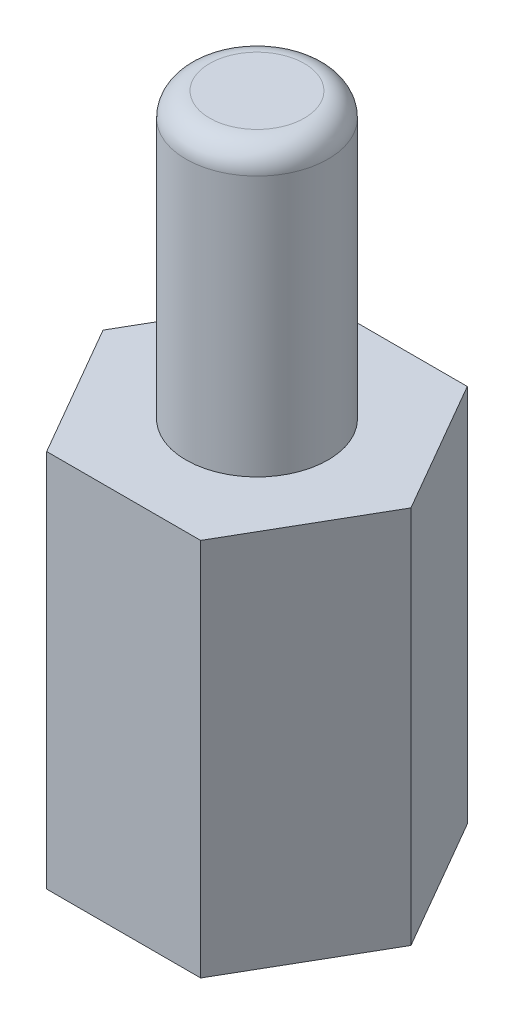
ISO-10303-21;
HEADER;
FILE_DESCRIPTION(('STEP AP214'),'2;1');
FILE_NAME('part.step','',(''),(''),'','','');
FILE_SCHEMA(('AUTOMOTIVE_DESIGN { 1 0 10303 214 1 1 1 1 }'));
ENDSEC;
DATA;
#1=APPLICATION_CONTEXT('core data for automotive mechanical design processes');
#2=APPLICATION_PROTOCOL_DEFINITION('international standard','automotive_design',2000,#1);
#3=PRODUCT_CONTEXT('',#1,'mechanical');
#4=PRODUCT('Part','Part','',(#3));
#5=PRODUCT_RELATED_PRODUCT_CATEGORY('part','',(#4));
#6=PRODUCT_DEFINITION_FORMATION('','',#4);
#7=PRODUCT_DEFINITION_CONTEXT('part definition',#1,'design');
#8=PRODUCT_DEFINITION('design','',#6,#7);
#9=PRODUCT_DEFINITION_SHAPE('','',#8);
#10=(LENGTH_UNIT() NAMED_UNIT(*) SI_UNIT(.MILLI.,.METRE.));
#11=(NAMED_UNIT(*) PLANE_ANGLE_UNIT() SI_UNIT($,.RADIAN.));
#12=(NAMED_UNIT(*) SI_UNIT($,.STERADIAN.) SOLID_ANGLE_UNIT());
#13=UNCERTAINTY_MEASURE_WITH_UNIT(LENGTH_MEASURE(1.E-05),#10,'distance_accuracy_value','');
#14=(GEOMETRIC_REPRESENTATION_CONTEXT(3) GLOBAL_UNCERTAINTY_ASSIGNED_CONTEXT((#13)) GLOBAL_UNIT_ASSIGNED_CONTEXT((#10,
#11,#12)) REPRESENTATION_CONTEXT('',''));
#15=CARTESIAN_POINT('',(0.,0.,0.));
#16=DIRECTION('',(0.,0.,1.));
#17=DIRECTION('',(1.,0.,0.));
#18=AXIS2_PLACEMENT_3D('',#15,#16,#17);
#19=CARTESIAN_POINT('',(0.,14.,0.));
#20=DIRECTION('',(0.,-1.,0.));
#21=DIRECTION('',(0.,0.,-1.));
#22=AXIS2_PLACEMENT_3D('',#19,#20,#21);
#23=CYLINDRICAL_SURFACE('',#22,1.5);
#24=CARTESIAN_POINT('',(0.,8.,0.));
#25=DIRECTION('',(0.,1.,0.));
#26=DIRECTION('',(0.,0.,1.));
#27=AXIS2_PLACEMENT_3D('',#24,#25,#26);
#28=CIRCLE('',#27,1.5);
#29=CARTESIAN_POINT('',(0.,8.,1.5));
#30=VERTEX_POINT('',#29);
#31=EDGE_CURVE('E138',#30,#30,#28,.T.);
#32=ORIENTED_EDGE('',*,*,#31,.T.);
#33=EDGE_LOOP('',(#32));
#34=FACE_BOUND('',#33,.T.);
#35=CARTESIAN_POINT('',(0.,13.5,0.));
#36=DIRECTION('',(0.,1.,0.));
#37=DIRECTION('',(0.,0.,1.));
#38=AXIS2_PLACEMENT_3D('',#35,#36,#37);
#39=CIRCLE('',#38,1.5);
#40=CARTESIAN_POINT('',(0.,13.5,1.5));
#41=VERTEX_POINT('',#40);
#42=EDGE_CURVE('E11',#41,#41,#39,.F.);
#43=ORIENTED_EDGE('',*,*,#42,.T.);
#44=EDGE_LOOP('',(#43));
#45=FACE_BOUND('',#44,.T.);
#46=ADVANCED_FACE('F41',(#34,#45),#23,.T.);
#47=CARTESIAN_POINT('',(0.,14.,0.));
#48=DIRECTION('',(0.,1.,0.));
#49=DIRECTION('',(0.,0.,1.));
#50=AXIS2_PLACEMENT_3D('',#47,#48,#49);
#51=PLANE('',#50);
#52=CARTESIAN_POINT('',(0.,14.,0.));
#53=DIRECTION('',(0.,1.,0.));
#54=DIRECTION('',(0.,0.,1.));
#55=AXIS2_PLACEMENT_3D('',#52,#53,#54);
#56=CIRCLE('',#55,1.);
#57=CARTESIAN_POINT('',(0.,14.,1.));
#58=VERTEX_POINT('',#57);
#59=EDGE_CURVE('E51',#58,#58,#56,.T.);
#60=ORIENTED_EDGE('',*,*,#59,.T.);
#61=EDGE_LOOP('',(#60));
#62=FACE_BOUND('',#61,.T.);
#63=ADVANCED_FACE('F167',(#62),#51,.T.);
#64=CARTESIAN_POINT('',(0.,13.5,0.));
#65=DIRECTION('',(0.,1.,0.));
#66=DIRECTION('',(0.,0.,1.));
#67=AXIS2_PLACEMENT_3D('',#64,#65,#66);
#68=TOROIDAL_SURFACE('',#67,1.,0.5);
#69=ORIENTED_EDGE('',*,*,#42,.F.);
#70=EDGE_LOOP('',(#69));
#71=FACE_BOUND('',#70,.T.);
#72=ORIENTED_EDGE('',*,*,#59,.F.);
#73=EDGE_LOOP('',(#72));
#74=FACE_BOUND('',#73,.T.);
#75=ADVANCED_FACE('F43',(#71,#74),#68,.T.);
#76=CARTESIAN_POINT('',(0.,8.,0.));
#77=DIRECTION('',(0.,1.,0.));
#78=DIRECTION('',(0.,0.,1.));
#79=AXIS2_PLACEMENT_3D('',#76,#77,#78);
#80=PLANE('',#79);
#81=DIRECTION('',(-1.,0.,0.));
#82=VECTOR('',#81,1.);
#83=CARTESIAN_POINT('',(1.62499999999999,8.,-2.81458256229941));
#84=LINE('',#83,#82);
#85=CARTESIAN_POINT('',(1.62499999999999,8.,-2.81458256229941));
#86=VERTEX_POINT('',#85);
#87=CARTESIAN_POINT('',(-1.62499999999999,8.,-2.81458256229941));
#88=VERTEX_POINT('',#87);
#89=EDGE_CURVE('E150',#86,#88,#84,.T.);
#90=ORIENTED_EDGE('',*,*,#89,.T.);
#91=DIRECTION('',(-0.5,0.,0.866025403784439));
#92=VECTOR('',#91,1.);
#93=CARTESIAN_POINT('',(-1.62499999999999,8.,-2.81458256229941));
#94=LINE('',#93,#92);
#95=CARTESIAN_POINT('',(-3.24999999999998,8.,0.));
#96=VERTEX_POINT('',#95);
#97=EDGE_CURVE('E97',#88,#96,#94,.T.);
#98=ORIENTED_EDGE('',*,*,#97,.T.);
#99=DIRECTION('',(0.5,0.,0.866025403784439));
#100=VECTOR('',#99,1.);
#101=CARTESIAN_POINT('',(-3.24999999999998,8.,0.));
#102=LINE('',#101,#100);
#103=CARTESIAN_POINT('',(-1.62499999999999,8.,2.81458256229941));
#104=VERTEX_POINT('',#103);
#105=EDGE_CURVE('E111',#96,#104,#102,.T.);
#106=ORIENTED_EDGE('',*,*,#105,.T.);
#107=DIRECTION('',(1.,0.,0.));
#108=VECTOR('',#107,1.);
#109=CARTESIAN_POINT('',(-1.62499999999999,8.,2.81458256229941));
#110=LINE('',#109,#108);
#111=CARTESIAN_POINT('',(1.62499999999999,8.,2.81458256229941));
#112=VERTEX_POINT('',#111);
#113=EDGE_CURVE('E104',#104,#112,#110,.T.);
#114=ORIENTED_EDGE('',*,*,#113,.T.);
#115=DIRECTION('',(0.5,0.,-0.866025403784438));
#116=VECTOR('',#115,1.);
#117=CARTESIAN_POINT('',(1.62499999999999,8.,2.81458256229941));
#118=LINE('',#117,#116);
#119=CARTESIAN_POINT('',(3.24999999999999,8.,0.));
#120=VERTEX_POINT('',#119);
#121=EDGE_CURVE('E109',#112,#120,#118,.T.);
#122=ORIENTED_EDGE('',*,*,#121,.T.);
#123=DIRECTION('',(-0.5,0.,-0.866025403784439));
#124=VECTOR('',#123,1.);
#125=CARTESIAN_POINT('',(3.24999999999999,8.,0.));
#126=LINE('',#125,#124);
#127=EDGE_CURVE('E59',#120,#86,#126,.T.);
#128=ORIENTED_EDGE('',*,*,#127,.T.);
#129=EDGE_LOOP('',(#90,#98,#106,#114,#122,#128));
#130=FACE_BOUND('',#129,.T.);
#131=ORIENTED_EDGE('',*,*,#31,.F.);
#132=EDGE_LOOP('',(#131));
#133=FACE_BOUND('',#132,.T.);
#134=ADVANCED_FACE('F106',(#130,#133),#80,.T.);
#135=CARTESIAN_POINT('',(1.62499999999999,8.,-2.81458256229941));
#136=DIRECTION('',(0.,0.,1.));
#137=DIRECTION('',(1.,0.,0.));
#138=AXIS2_PLACEMENT_3D('',#135,#136,#137);
#139=PLANE('',#138);
#140=DIRECTION('',(-1.,0.,0.));
#141=VECTOR('',#140,1.);
#142=CARTESIAN_POINT('',(1.62499999999999,0.,-2.81458256229941));
#143=LINE('',#142,#141);
#144=CARTESIAN_POINT('',(1.62499999999999,0.,-2.81458256229941));
#145=VERTEX_POINT('',#144);
#146=CARTESIAN_POINT('',(-1.62499999999999,0.,-2.81458256229941));
#147=VERTEX_POINT('',#146);
#148=EDGE_CURVE('E133',#145,#147,#143,.T.);
#149=ORIENTED_EDGE('',*,*,#148,.T.);
#150=DIRECTION('',(0.,-1.,0.));
#151=VECTOR('',#150,1.);
#152=CARTESIAN_POINT('',(-1.62499999999999,8.,-2.81458256229941));
#153=LINE('',#152,#151);
#154=EDGE_CURVE('E161',#88,#147,#153,.T.);
#155=ORIENTED_EDGE('',*,*,#154,.F.);
#156=ORIENTED_EDGE('',*,*,#89,.F.);
#157=DIRECTION('',(0.,-1.,0.));
#158=VECTOR('',#157,1.);
#159=CARTESIAN_POINT('',(1.62499999999999,8.,-2.81458256229941));
#160=LINE('',#159,#158);
#161=EDGE_CURVE('E129',#86,#145,#160,.T.);
#162=ORIENTED_EDGE('',*,*,#161,.T.);
#163=EDGE_LOOP('',(#149,#155,#156,#162));
#164=FACE_BOUND('',#163,.T.);
#165=ADVANCED_FACE('F175',(#164),#139,.F.);
#166=CARTESIAN_POINT('',(-1.62499999999999,8.,-2.81458256229941));
#167=DIRECTION('',(0.866025403784439,0.,0.5));
#168=DIRECTION('',(0.5,0.,-0.866025403784439));
#169=AXIS2_PLACEMENT_3D('',#166,#167,#168);
#170=PLANE('',#169);
#171=DIRECTION('',(-0.5,0.,0.866025403784439));
#172=VECTOR('',#171,1.);
#173=CARTESIAN_POINT('',(-1.62499999999999,0.,-2.81458256229941));
#174=LINE('',#173,#172);
#175=CARTESIAN_POINT('',(-3.24999999999998,0.,0.));
#176=VERTEX_POINT('',#175);
#177=EDGE_CURVE('E137',#147,#176,#174,.T.);
#178=ORIENTED_EDGE('',*,*,#177,.T.);
#179=DIRECTION('',(0.,-1.,0.));
#180=VECTOR('',#179,1.);
#181=CARTESIAN_POINT('',(-3.24999999999998,8.,0.));
#182=LINE('',#181,#180);
#183=EDGE_CURVE('E157',#96,#176,#182,.T.);
#184=ORIENTED_EDGE('',*,*,#183,.F.);
#185=ORIENTED_EDGE('',*,*,#97,.F.);
#186=ORIENTED_EDGE('',*,*,#154,.T.);
#187=EDGE_LOOP('',(#178,#184,#185,#186));
#188=FACE_BOUND('',#187,.T.);
#189=ADVANCED_FACE('F194',(#188),#170,.F.);
#190=CARTESIAN_POINT('',(-3.24999999999998,8.,0.));
#191=DIRECTION('',(0.866025403784439,0.,-0.5));
#192=DIRECTION('',(-0.5,0.,-0.866025403784439));
#193=AXIS2_PLACEMENT_3D('',#190,#191,#192);
#194=PLANE('',#193);
#195=DIRECTION('',(0.5,0.,0.866025403784439));
#196=VECTOR('',#195,1.);
#197=CARTESIAN_POINT('',(-3.24999999999998,0.,0.));
#198=LINE('',#197,#196);
#199=CARTESIAN_POINT('',(-1.62499999999999,0.,2.81458256229941));
#200=VERTEX_POINT('',#199);
#201=EDGE_CURVE('E141',#176,#200,#198,.T.);
#202=ORIENTED_EDGE('',*,*,#201,.T.);
#203=DIRECTION('',(0.,-1.,0.));
#204=VECTOR('',#203,1.);
#205=CARTESIAN_POINT('',(-1.62499999999999,8.,2.81458256229941));
#206=LINE('',#205,#204);
#207=EDGE_CURVE('E122',#104,#200,#206,.T.);
#208=ORIENTED_EDGE('',*,*,#207,.F.);
#209=ORIENTED_EDGE('',*,*,#105,.F.);
#210=ORIENTED_EDGE('',*,*,#183,.T.);
#211=EDGE_LOOP('',(#202,#208,#209,#210));
#212=FACE_BOUND('',#211,.T.);
#213=ADVANCED_FACE('F198',(#212),#194,.F.);
#214=CARTESIAN_POINT('',(-1.62499999999999,8.,2.81458256229941));
#215=DIRECTION('',(0.,0.,-1.));
#216=DIRECTION('',(-1.,0.,0.));
#217=AXIS2_PLACEMENT_3D('',#214,#215,#216);
#218=PLANE('',#217);
#219=DIRECTION('',(1.,0.,0.));
#220=VECTOR('',#219,1.);
#221=CARTESIAN_POINT('',(-1.62499999999999,0.,2.81458256229941));
#222=LINE('',#221,#220);
#223=CARTESIAN_POINT('',(1.62499999999999,0.,2.81458256229941));
#224=VERTEX_POINT('',#223);
#225=EDGE_CURVE('E120',#200,#224,#222,.T.);
#226=ORIENTED_EDGE('',*,*,#225,.T.);
#227=DIRECTION('',(0.,-1.,0.));
#228=VECTOR('',#227,1.);
#229=CARTESIAN_POINT('',(1.62499999999999,8.,2.81458256229941));
#230=LINE('',#229,#228);
#231=EDGE_CURVE('E117',#112,#224,#230,.T.);
#232=ORIENTED_EDGE('',*,*,#231,.F.);
#233=ORIENTED_EDGE('',*,*,#113,.F.);
#234=ORIENTED_EDGE('',*,*,#207,.T.);
#235=EDGE_LOOP('',(#226,#232,#233,#234));
#236=FACE_BOUND('',#235,.T.);
#237=ADVANCED_FACE('F118',(#236),#218,.F.);
#238=CARTESIAN_POINT('',(1.62499999999999,8.,2.81458256229941));
#239=DIRECTION('',(-0.866025403784438,0.,-0.5));
#240=DIRECTION('',(-0.5,0.,0.866025403784439));
#241=AXIS2_PLACEMENT_3D('',#238,#239,#240);
#242=PLANE('',#241);
#243=DIRECTION('',(0.5,0.,-0.866025403784438));
#244=VECTOR('',#243,1.);
#245=CARTESIAN_POINT('',(1.62499999999999,0.,2.81458256229941));
#246=LINE('',#245,#244);
#247=CARTESIAN_POINT('',(3.24999999999999,0.,0.));
#248=VERTEX_POINT('',#247);
#249=EDGE_CURVE('E82',#224,#248,#246,.T.);
#250=ORIENTED_EDGE('',*,*,#249,.T.);
#251=DIRECTION('',(0.,-1.,0.));
#252=VECTOR('',#251,1.);
#253=CARTESIAN_POINT('',(3.24999999999999,8.,0.));
#254=LINE('',#253,#252);
#255=EDGE_CURVE('E123',#120,#248,#254,.T.);
#256=ORIENTED_EDGE('',*,*,#255,.F.);
#257=ORIENTED_EDGE('',*,*,#121,.F.);
#258=ORIENTED_EDGE('',*,*,#231,.T.);
#259=EDGE_LOOP('',(#250,#256,#257,#258));
#260=FACE_BOUND('',#259,.T.);
#261=ADVANCED_FACE('F125',(#260),#242,.F.);
#262=CARTESIAN_POINT('',(3.24999999999999,8.,0.));
#263=DIRECTION('',(-0.866025403784439,0.,0.5));
#264=DIRECTION('',(0.5,0.,0.866025403784439));
#265=AXIS2_PLACEMENT_3D('',#262,#263,#264);
#266=PLANE('',#265);
#267=DIRECTION('',(-0.5,0.,-0.866025403784439));
#268=VECTOR('',#267,1.);
#269=CARTESIAN_POINT('',(3.24999999999999,0.,0.));
#270=LINE('',#269,#268);
#271=EDGE_CURVE('E88',#248,#145,#270,.T.);
#272=ORIENTED_EDGE('',*,*,#271,.T.);
#273=ORIENTED_EDGE('',*,*,#161,.F.);
#274=ORIENTED_EDGE('',*,*,#127,.F.);
#275=ORIENTED_EDGE('',*,*,#255,.T.);
#276=EDGE_LOOP('',(#272,#273,#274,#275));
#277=FACE_BOUND('',#276,.T.);
#278=ADVANCED_FACE('F189',(#277),#266,.F.);
#279=CARTESIAN_POINT('',(0.,0.,0.));
#280=DIRECTION('',(0.,1.,0.));
#281=DIRECTION('',(0.,0.,1.));
#282=AXIS2_PLACEMENT_3D('',#279,#280,#281);
#283=PLANE('',#282);
#284=CARTESIAN_POINT('',(0.,0.,0.));
#285=DIRECTION('',(0.,1.,0.));
#286=DIRECTION('',(0.,0.,1.));
#287=AXIS2_PLACEMENT_3D('',#284,#285,#286);
#288=CIRCLE('',#287,1.5);
#289=CARTESIAN_POINT('',(0.,0.,1.5));
#290=VERTEX_POINT('',#289);
#291=EDGE_CURVE('E220',#290,#290,#288,.T.);
#292=ORIENTED_EDGE('',*,*,#291,.T.);
#293=EDGE_LOOP('',(#292));
#294=FACE_BOUND('',#293,.T.);
#295=ORIENTED_EDGE('',*,*,#148,.F.);
#296=ORIENTED_EDGE('',*,*,#271,.F.);
#297=ORIENTED_EDGE('',*,*,#249,.F.);
#298=ORIENTED_EDGE('',*,*,#225,.F.);
#299=ORIENTED_EDGE('',*,*,#201,.F.);
#300=ORIENTED_EDGE('',*,*,#177,.F.);
#301=EDGE_LOOP('',(#295,#296,#297,#298,#299,#300));
#302=FACE_BOUND('',#301,.T.);
#303=ADVANCED_FACE('F186',(#294,#302),#283,.F.);
#304=CARTESIAN_POINT('',(0.,7.,0.));
#305=DIRECTION('',(0.,-1.,0.));
#306=DIRECTION('',(0.,0.,-1.));
#307=AXIS2_PLACEMENT_3D('',#304,#305,#306);
#308=CYLINDRICAL_SURFACE('',#307,1.5);
#309=CARTESIAN_POINT('',(0.,7.,0.));
#310=DIRECTION('',(0.,1.,0.));
#311=DIRECTION('',(0.,0.,1.));
#312=AXIS2_PLACEMENT_3D('',#309,#310,#311);
#313=CIRCLE('',#312,1.5);
#314=CARTESIAN_POINT('',(0.,7.,1.5));
#315=VERTEX_POINT('',#314);
#316=EDGE_CURVE('E218',#315,#315,#313,.T.);
#317=ORIENTED_EDGE('',*,*,#316,.T.);
#318=EDGE_LOOP('',(#317));
#319=FACE_BOUND('',#318,.T.);
#320=ORIENTED_EDGE('',*,*,#291,.F.);
#321=EDGE_LOOP('',(#320));
#322=FACE_BOUND('',#321,.T.);
#323=ADVANCED_FACE('F188',(#319,#322),#308,.F.);
#324=CARTESIAN_POINT('',(0.,7.,0.));
#325=DIRECTION('',(0.,1.,0.));
#326=DIRECTION('',(0.,0.,1.));
#327=AXIS2_PLACEMENT_3D('',#324,#325,#326);
#328=PLANE('',#327);
#329=ORIENTED_EDGE('',*,*,#316,.F.);
#330=EDGE_LOOP('',(#329));
#331=FACE_BOUND('',#330,.T.);
#332=ADVANCED_FACE('F210',(#331),#328,.F.);
#333=CLOSED_SHELL('',(#46,#63,#75,#134,#165,#189,#213,#237,#261,#278,#303,#323,#332));
#334=MANIFOLD_SOLID_BREP('B2',#333);
#335=ADVANCED_BREP_SHAPE_REPRESENTATION('',(#18,#334),#14);
#336=SHAPE_DEFINITION_REPRESENTATION(#9,#335);
ENDSEC;
END-ISO-10303-21;
